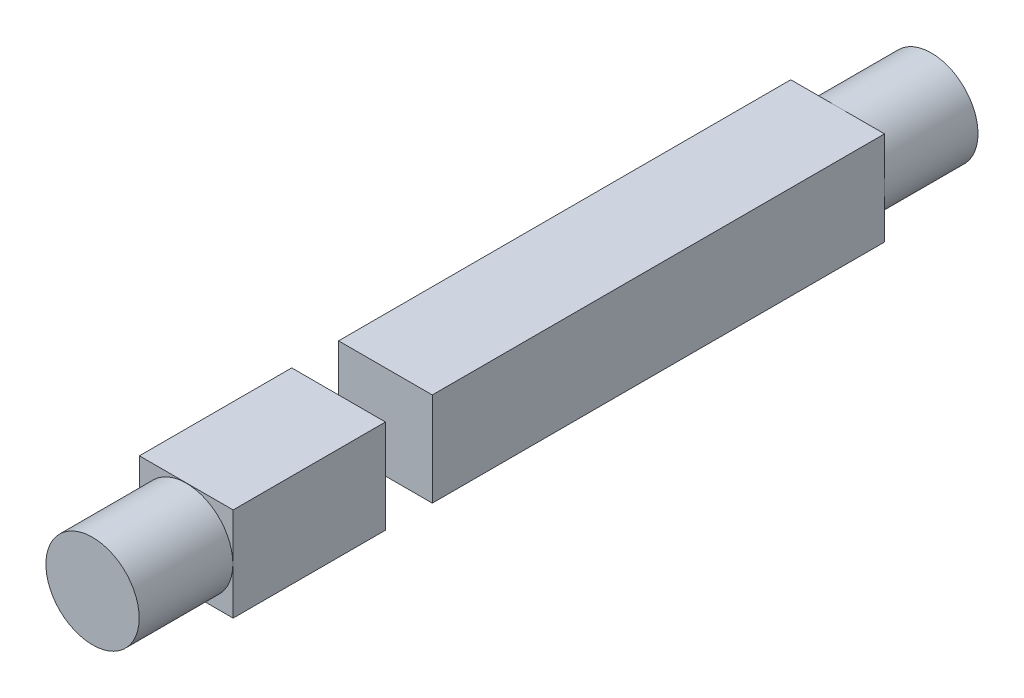
ISO-10303-21;
HEADER;
FILE_DESCRIPTION(('STEP AP214'),'2;1');
FILE_NAME('part.step','',(''),(''),'','','');
FILE_SCHEMA(('AUTOMOTIVE_DESIGN { 1 0 10303 214 1 1 1 1 }'));
ENDSEC;
DATA;
#1=APPLICATION_CONTEXT('core data for automotive mechanical design processes');
#2=APPLICATION_PROTOCOL_DEFINITION('international standard','automotive_design',2000,#1);
#3=PRODUCT_CONTEXT('',#1,'mechanical');
#4=PRODUCT('Part','Part','',(#3));
#5=PRODUCT_RELATED_PRODUCT_CATEGORY('part','',(#4));
#6=PRODUCT_DEFINITION_FORMATION('','',#4);
#7=PRODUCT_DEFINITION_CONTEXT('part definition',#1,'design');
#8=PRODUCT_DEFINITION('design','',#6,#7);
#9=PRODUCT_DEFINITION_SHAPE('','',#8);
#10=(LENGTH_UNIT() NAMED_UNIT(*) SI_UNIT(.MILLI.,.METRE.));
#11=(NAMED_UNIT(*) PLANE_ANGLE_UNIT() SI_UNIT($,.RADIAN.));
#12=(NAMED_UNIT(*) SI_UNIT($,.STERADIAN.) SOLID_ANGLE_UNIT());
#13=UNCERTAINTY_MEASURE_WITH_UNIT(LENGTH_MEASURE(1.E-05),#10,'distance_accuracy_value','');
#14=(GEOMETRIC_REPRESENTATION_CONTEXT(3) GLOBAL_UNCERTAINTY_ASSIGNED_CONTEXT((#13)) GLOBAL_UNIT_ASSIGNED_CONTEXT((#10,
#11,#12)) REPRESENTATION_CONTEXT('',''));
#15=CARTESIAN_POINT('',(0.,0.,0.));
#16=DIRECTION('',(0.,0.,1.));
#17=DIRECTION('',(1.,0.,0.));
#18=AXIS2_PLACEMENT_3D('',#15,#16,#17);
#19=CARTESIAN_POINT('',(-2.,-2.,13.9));
#20=DIRECTION('',(1.,0.,0.));
#21=DIRECTION('',(0.,0.,-1.));
#22=AXIS2_PLACEMENT_3D('',#19,#20,#21);
#23=PLANE('',#22);
#24=DIRECTION('',(0.,0.,-1.));
#25=VECTOR('',#24,1.);
#26=CARTESIAN_POINT('',(-2.,-2.,13.9));
#27=LINE('',#26,#25);
#28=CARTESIAN_POINT('',(-2.,-2.,5.4));
#29=VERTEX_POINT('',#28);
#30=CARTESIAN_POINT('',(-2.,-2.,-13.9));
#31=VERTEX_POINT('',#30);
#32=EDGE_CURVE('E98',#29,#31,#27,.T.);
#33=ORIENTED_EDGE('',*,*,#32,.F.);
#34=DIRECTION('',(0.,1.,0.));
#35=VECTOR('',#34,1.);
#36=CARTESIAN_POINT('',(-2.,-2.001,5.4));
#37=LINE('',#36,#35);
#38=CARTESIAN_POINT('',(-2.,2.,5.4));
#39=VERTEX_POINT('',#38);
#40=EDGE_CURVE('E66',#29,#39,#37,.T.);
#41=ORIENTED_EDGE('',*,*,#40,.T.);
#42=DIRECTION('',(0.,0.,-1.));
#43=VECTOR('',#42,1.);
#44=CARTESIAN_POINT('',(-2.,2.,13.9));
#45=LINE('',#44,#43);
#46=CARTESIAN_POINT('',(-2.,2.,-13.9));
#47=VERTEX_POINT('',#46);
#48=EDGE_CURVE('E53',#39,#47,#45,.T.);
#49=ORIENTED_EDGE('',*,*,#48,.T.);
#50=DIRECTION('',(0.,-1.,0.));
#51=VECTOR('',#50,1.);
#52=CARTESIAN_POINT('',(-2.,-2.,-13.9));
#53=LINE('',#52,#51);
#54=EDGE_CURVE('E104',#47,#31,#53,.T.);
#55=ORIENTED_EDGE('',*,*,#54,.T.);
#56=EDGE_LOOP('',(#33,#41,#49,#55));
#57=FACE_BOUND('',#56,.T.);
#58=ADVANCED_FACE('F50',(#57),#23,.F.);
#59=CARTESIAN_POINT('',(2.,-2.,13.9));
#60=DIRECTION('',(0.,1.,0.));
#61=DIRECTION('',(-1.,0.,0.));
#62=AXIS2_PLACEMENT_3D('',#59,#60,#61);
#63=PLANE('',#62);
#64=DIRECTION('',(0.,0.,-1.));
#65=VECTOR('',#64,1.);
#66=CARTESIAN_POINT('',(2.,-2.,13.9));
#67=LINE('',#66,#65);
#68=CARTESIAN_POINT('',(2.,-2.,5.4));
#69=VERTEX_POINT('',#68);
#70=CARTESIAN_POINT('',(2.,-2.,-13.9));
#71=VERTEX_POINT('',#70);
#72=EDGE_CURVE('E111',#69,#71,#67,.T.);
#73=ORIENTED_EDGE('',*,*,#72,.F.);
#74=DIRECTION('',(1.,0.,0.));
#75=VECTOR('',#74,1.);
#76=CARTESIAN_POINT('',(-2.,-2.,5.4));
#77=LINE('',#76,#75);
#78=EDGE_CURVE('E75',#29,#69,#77,.T.);
#79=ORIENTED_EDGE('',*,*,#78,.F.);
#80=ORIENTED_EDGE('',*,*,#32,.T.);
#81=DIRECTION('',(1.,0.,0.));
#82=VECTOR('',#81,1.);
#83=CARTESIAN_POINT('',(2.,-2.,-13.9));
#84=LINE('',#83,#82);
#85=EDGE_CURVE('E102',#31,#71,#84,.T.);
#86=ORIENTED_EDGE('',*,*,#85,.T.);
#87=EDGE_LOOP('',(#73,#79,#80,#86));
#88=FACE_BOUND('',#87,.T.);
#89=ADVANCED_FACE('F101',(#88),#63,.F.);
#90=CARTESIAN_POINT('',(2.,-2.,13.9));
#91=DIRECTION('',(-1.,0.,0.));
#92=DIRECTION('',(0.,0.,1.));
#93=AXIS2_PLACEMENT_3D('',#90,#91,#92);
#94=PLANE('',#93);
#95=DIRECTION('',(0.,0.,-1.));
#96=VECTOR('',#95,1.);
#97=CARTESIAN_POINT('',(2.,2.,13.9));
#98=LINE('',#97,#96);
#99=CARTESIAN_POINT('',(2.,2.,5.4));
#100=VERTEX_POINT('',#99);
#101=CARTESIAN_POINT('',(2.,2.,-13.9));
#102=VERTEX_POINT('',#101);
#103=EDGE_CURVE('E85',#100,#102,#98,.T.);
#104=ORIENTED_EDGE('',*,*,#103,.F.);
#105=DIRECTION('',(0.,1.,0.));
#106=VECTOR('',#105,1.);
#107=CARTESIAN_POINT('',(2.,-2.001,5.4));
#108=LINE('',#107,#106);
#109=EDGE_CURVE('E59',#69,#100,#108,.T.);
#110=ORIENTED_EDGE('',*,*,#109,.F.);
#111=ORIENTED_EDGE('',*,*,#72,.T.);
#112=DIRECTION('',(0.,1.,0.));
#113=VECTOR('',#112,1.);
#114=CARTESIAN_POINT('',(2.,-2.,-13.9));
#115=LINE('',#114,#113);
#116=EDGE_CURVE('E110',#71,#102,#115,.T.);
#117=ORIENTED_EDGE('',*,*,#116,.T.);
#118=EDGE_LOOP('',(#104,#110,#111,#117));
#119=FACE_BOUND('',#118,.T.);
#120=ADVANCED_FACE('F128',(#119),#94,.F.);
#121=CARTESIAN_POINT('',(2.,2.,13.9));
#122=DIRECTION('',(0.,-1.,0.));
#123=DIRECTION('',(1.,0.,0.));
#124=AXIS2_PLACEMENT_3D('',#121,#122,#123);
#125=PLANE('',#124);
#126=ORIENTED_EDGE('',*,*,#48,.F.);
#127=DIRECTION('',(-1.,0.,0.));
#128=VECTOR('',#127,1.);
#129=CARTESIAN_POINT('',(-2.,2.,5.4));
#130=LINE('',#129,#128);
#131=EDGE_CURVE('E12',#100,#39,#130,.T.);
#132=ORIENTED_EDGE('',*,*,#131,.F.);
#133=ORIENTED_EDGE('',*,*,#103,.T.);
#134=DIRECTION('',(-1.,0.,0.));
#135=VECTOR('',#134,1.);
#136=CARTESIAN_POINT('',(2.,2.,-13.9));
#137=LINE('',#136,#135);
#138=EDGE_CURVE('E120',#102,#47,#137,.T.);
#139=ORIENTED_EDGE('',*,*,#138,.T.);
#140=EDGE_LOOP('',(#126,#132,#133,#139));
#141=FACE_BOUND('',#140,.T.);
#142=ADVANCED_FACE('F129',(#141),#125,.F.);
#143=CARTESIAN_POINT('',(0.,0.,-13.9));
#144=DIRECTION('',(0.,0.,1.));
#145=DIRECTION('',(1.,0.,0.));
#146=AXIS2_PLACEMENT_3D('',#143,#144,#145);
#147=PLANE('',#146);
#148=CARTESIAN_POINT('',(0.,0.,-13.9));
#149=DIRECTION('',(0.,0.,1.));
#150=DIRECTION('',(1.,0.,0.));
#151=AXIS2_PLACEMENT_3D('',#148,#149,#150);
#152=CIRCLE('',#151,1.99);
#153=CARTESIAN_POINT('',(1.99,0.,-13.9));
#154=VERTEX_POINT('',#153);
#155=EDGE_CURVE('E116',#154,#154,#152,.T.);
#156=ORIENTED_EDGE('',*,*,#155,.T.);
#157=EDGE_LOOP('',(#156));
#158=FACE_BOUND('',#157,.T.);
#159=ORIENTED_EDGE('',*,*,#54,.F.);
#160=ORIENTED_EDGE('',*,*,#138,.F.);
#161=ORIENTED_EDGE('',*,*,#116,.F.);
#162=ORIENTED_EDGE('',*,*,#85,.F.);
#163=EDGE_LOOP('',(#159,#160,#161,#162));
#164=FACE_BOUND('',#163,.T.);
#165=ADVANCED_FACE('F108',(#158,#164),#147,.F.);
#166=CARTESIAN_POINT('',(0.,0.,-17.9));
#167=DIRECTION('',(0.,0.,1.));
#168=DIRECTION('',(1.,0.,0.));
#169=AXIS2_PLACEMENT_3D('',#166,#167,#168);
#170=CYLINDRICAL_SURFACE('',#169,1.99);
#171=CARTESIAN_POINT('',(0.,0.,-17.9));
#172=DIRECTION('',(0.,0.,1.));
#173=DIRECTION('',(1.,0.,0.));
#174=AXIS2_PLACEMENT_3D('',#171,#172,#173);
#175=CIRCLE('',#174,1.99);
#176=CARTESIAN_POINT('',(1.99,0.,-17.9));
#177=VERTEX_POINT('',#176);
#178=EDGE_CURVE('E119',#177,#177,#175,.T.);
#179=ORIENTED_EDGE('',*,*,#178,.T.);
#180=EDGE_LOOP('',(#179));
#181=FACE_BOUND('',#180,.T.);
#182=ORIENTED_EDGE('',*,*,#155,.F.);
#183=EDGE_LOOP('',(#182));
#184=FACE_BOUND('',#183,.T.);
#185=ADVANCED_FACE('F137',(#181,#184),#170,.T.);
#186=CARTESIAN_POINT('',(0.,0.,-17.9));
#187=DIRECTION('',(0.,0.,-1.));
#188=DIRECTION('',(1.,0.,0.));
#189=AXIS2_PLACEMENT_3D('',#186,#187,#188);
#190=PLANE('',#189);
#191=ORIENTED_EDGE('',*,*,#178,.F.);
#192=EDGE_LOOP('',(#191));
#193=FACE_BOUND('',#192,.T.);
#194=ADVANCED_FACE('F132',(#193),#190,.T.);
#195=CARTESIAN_POINT('',(-2.,-2.001,5.4));
#196=DIRECTION('',(0.,0.,-1.));
#197=DIRECTION('',(-1.,0.,0.));
#198=AXIS2_PLACEMENT_3D('',#195,#196,#197);
#199=PLANE('',#198);
#200=ORIENTED_EDGE('',*,*,#78,.T.);
#201=ORIENTED_EDGE('',*,*,#109,.T.);
#202=ORIENTED_EDGE('',*,*,#131,.T.);
#203=ORIENTED_EDGE('',*,*,#40,.F.);
#204=EDGE_LOOP('',(#200,#201,#202,#203));
#205=FACE_BOUND('',#204,.T.);
#206=ADVANCED_FACE('F130',(#205),#199,.F.);
#207=CLOSED_SHELL('',(#58,#89,#120,#142,#165,#185,#194,#206));
#208=MANIFOLD_SOLID_BREP('B2',#207);
#209=CARTESIAN_POINT('',(0.,0.,17.9));
#210=DIRECTION('',(0.,0.,1.));
#211=DIRECTION('',(1.,0.,0.));
#212=AXIS2_PLACEMENT_3D('',#209,#210,#211);
#213=PLANE('',#212);
#214=CARTESIAN_POINT('',(0.,0.,17.9));
#215=DIRECTION('',(0.,0.,1.));
#216=DIRECTION('',(1.,0.,0.));
#217=AXIS2_PLACEMENT_3D('',#214,#215,#216);
#218=CIRCLE('',#217,1.99);
#219=CARTESIAN_POINT('',(1.99,0.,17.9));
#220=VERTEX_POINT('',#219);
#221=EDGE_CURVE('E252',#220,#220,#218,.T.);
#222=ORIENTED_EDGE('',*,*,#221,.T.);
#223=EDGE_LOOP('',(#222));
#224=FACE_BOUND('',#223,.T.);
#225=ADVANCED_FACE('F203',(#224),#213,.T.);
#226=CARTESIAN_POINT('',(0.,0.,17.9));
#227=DIRECTION('',(0.,0.,-1.));
#228=DIRECTION('',(-1.,0.,0.));
#229=AXIS2_PLACEMENT_3D('',#226,#227,#228);
#230=CYLINDRICAL_SURFACE('',#229,1.99);
#231=ORIENTED_EDGE('',*,*,#221,.F.);
#232=EDGE_LOOP('',(#231));
#233=FACE_BOUND('',#232,.T.);
#234=CARTESIAN_POINT('',(0.,0.,13.9));
#235=DIRECTION('',(0.,0.,1.));
#236=DIRECTION('',(1.,0.,0.));
#237=AXIS2_PLACEMENT_3D('',#234,#235,#236);
#238=CIRCLE('',#237,1.99);
#239=CARTESIAN_POINT('',(1.99,0.,13.9));
#240=VERTEX_POINT('',#239);
#241=EDGE_CURVE('E48',#240,#240,#238,.T.);
#242=ORIENTED_EDGE('',*,*,#241,.T.);
#243=EDGE_LOOP('',(#242));
#244=FACE_BOUND('',#243,.T.);
#245=ADVANCED_FACE('F286',(#233,#244),#230,.T.);
#246=CARTESIAN_POINT('',(0.,0.,13.9));
#247=DIRECTION('',(0.,0.,1.));
#248=DIRECTION('',(1.,0.,0.));
#249=AXIS2_PLACEMENT_3D('',#246,#247,#248);
#250=PLANE('',#249);
#251=ORIENTED_EDGE('',*,*,#241,.F.);
#252=EDGE_LOOP('',(#251));
#253=FACE_BOUND('',#252,.T.);
#254=DIRECTION('',(0.,-1.,0.));
#255=VECTOR('',#254,1.);
#256=CARTESIAN_POINT('',(-2.,-2.,13.9));
#257=LINE('',#256,#255);
#258=CARTESIAN_POINT('',(-2.,2.,13.9));
#259=VERTEX_POINT('',#258);
#260=CARTESIAN_POINT('',(-2.,-2.,13.9));
#261=VERTEX_POINT('',#260);
#262=EDGE_CURVE('E275',#259,#261,#257,.T.);
#263=ORIENTED_EDGE('',*,*,#262,.T.);
#264=DIRECTION('',(1.,0.,0.));
#265=VECTOR('',#264,1.);
#266=CARTESIAN_POINT('',(2.,-2.,13.9));
#267=LINE('',#266,#265);
#268=CARTESIAN_POINT('',(2.,-2.,13.9));
#269=VERTEX_POINT('',#268);
#270=EDGE_CURVE('E262',#261,#269,#267,.T.);
#271=ORIENTED_EDGE('',*,*,#270,.T.);
#272=DIRECTION('',(0.,1.,0.));
#273=VECTOR('',#272,1.);
#274=CARTESIAN_POINT('',(2.,-2.,13.9));
#275=LINE('',#274,#273);
#276=CARTESIAN_POINT('',(2.,2.,13.9));
#277=VERTEX_POINT('',#276);
#278=EDGE_CURVE('E272',#269,#277,#275,.T.);
#279=ORIENTED_EDGE('',*,*,#278,.T.);
#280=DIRECTION('',(-1.,0.,0.));
#281=VECTOR('',#280,1.);
#282=CARTESIAN_POINT('',(2.,2.,13.9));
#283=LINE('',#282,#281);
#284=EDGE_CURVE('E227',#277,#259,#283,.T.);
#285=ORIENTED_EDGE('',*,*,#284,.T.);
#286=EDGE_LOOP('',(#263,#271,#279,#285));
#287=FACE_BOUND('',#286,.T.);
#288=ADVANCED_FACE('F284',(#253,#287),#250,.T.);
#289=CARTESIAN_POINT('',(2.,2.,13.9));
#290=DIRECTION('',(0.,-1.,0.));
#291=DIRECTION('',(1.,0.,0.));
#292=AXIS2_PLACEMENT_3D('',#289,#290,#291);
#293=PLANE('',#292);
#294=DIRECTION('',(0.,0.,-1.));
#295=VECTOR('',#294,1.);
#296=CARTESIAN_POINT('',(2.,2.,13.9));
#297=LINE('',#296,#295);
#298=CARTESIAN_POINT('',(2.,2.,7.4));
#299=VERTEX_POINT('',#298);
#300=EDGE_CURVE('E264',#277,#299,#297,.T.);
#301=ORIENTED_EDGE('',*,*,#300,.T.);
#302=DIRECTION('',(1.,0.,0.));
#303=VECTOR('',#302,1.);
#304=CARTESIAN_POINT('',(-2.,2.,7.4));
#305=LINE('',#304,#303);
#306=CARTESIAN_POINT('',(-2.,2.,7.4));
#307=VERTEX_POINT('',#306);
#308=EDGE_CURVE('E259',#307,#299,#305,.T.);
#309=ORIENTED_EDGE('',*,*,#308,.F.);
#310=DIRECTION('',(0.,0.,-1.));
#311=VECTOR('',#310,1.);
#312=CARTESIAN_POINT('',(-2.,2.,13.9));
#313=LINE('',#312,#311);
#314=EDGE_CURVE('E258',#259,#307,#313,.T.);
#315=ORIENTED_EDGE('',*,*,#314,.F.);
#316=ORIENTED_EDGE('',*,*,#284,.F.);
#317=EDGE_LOOP('',(#301,#309,#315,#316));
#318=FACE_BOUND('',#317,.T.);
#319=ADVANCED_FACE('F283',(#318),#293,.F.);
#320=CARTESIAN_POINT('',(2.,-2.,13.9));
#321=DIRECTION('',(-1.,0.,0.));
#322=DIRECTION('',(0.,0.,1.));
#323=AXIS2_PLACEMENT_3D('',#320,#321,#322);
#324=PLANE('',#323);
#325=DIRECTION('',(0.,0.,-1.));
#326=VECTOR('',#325,1.);
#327=CARTESIAN_POINT('',(2.,-2.,13.9));
#328=LINE('',#327,#326);
#329=CARTESIAN_POINT('',(2.,-2.,7.4));
#330=VERTEX_POINT('',#329);
#331=EDGE_CURVE('E263',#269,#330,#328,.T.);
#332=ORIENTED_EDGE('',*,*,#331,.T.);
#333=DIRECTION('',(0.,1.,0.));
#334=VECTOR('',#333,1.);
#335=CARTESIAN_POINT('',(2.,-2.001,7.4));
#336=LINE('',#335,#334);
#337=EDGE_CURVE('E247',#330,#299,#336,.T.);
#338=ORIENTED_EDGE('',*,*,#337,.T.);
#339=ORIENTED_EDGE('',*,*,#300,.F.);
#340=ORIENTED_EDGE('',*,*,#278,.F.);
#341=EDGE_LOOP('',(#332,#338,#339,#340));
#342=FACE_BOUND('',#341,.T.);
#343=ADVANCED_FACE('F282',(#342),#324,.F.);
#344=CARTESIAN_POINT('',(2.,-2.,13.9));
#345=DIRECTION('',(0.,1.,0.));
#346=DIRECTION('',(-1.,0.,0.));
#347=AXIS2_PLACEMENT_3D('',#344,#345,#346);
#348=PLANE('',#347);
#349=DIRECTION('',(0.,0.,-1.));
#350=VECTOR('',#349,1.);
#351=CARTESIAN_POINT('',(-2.,-2.,13.9));
#352=LINE('',#351,#350);
#353=CARTESIAN_POINT('',(-2.,-2.,7.4));
#354=VERTEX_POINT('',#353);
#355=EDGE_CURVE('E207',#261,#354,#352,.T.);
#356=ORIENTED_EDGE('',*,*,#355,.T.);
#357=DIRECTION('',(-1.,0.,0.));
#358=VECTOR('',#357,1.);
#359=CARTESIAN_POINT('',(-2.,-2.,7.4));
#360=LINE('',#359,#358);
#361=EDGE_CURVE('E244',#330,#354,#360,.T.);
#362=ORIENTED_EDGE('',*,*,#361,.F.);
#363=ORIENTED_EDGE('',*,*,#331,.F.);
#364=ORIENTED_EDGE('',*,*,#270,.F.);
#365=EDGE_LOOP('',(#356,#362,#363,#364));
#366=FACE_BOUND('',#365,.T.);
#367=ADVANCED_FACE('F261',(#366),#348,.F.);
#368=CARTESIAN_POINT('',(-2.,-2.,13.9));
#369=DIRECTION('',(1.,0.,0.));
#370=DIRECTION('',(0.,0.,-1.));
#371=AXIS2_PLACEMENT_3D('',#368,#369,#370);
#372=PLANE('',#371);
#373=ORIENTED_EDGE('',*,*,#314,.T.);
#374=DIRECTION('',(0.,1.,0.));
#375=VECTOR('',#374,1.);
#376=CARTESIAN_POINT('',(-2.,-2.001,7.4));
#377=LINE('',#376,#375);
#378=EDGE_CURVE('E219',#354,#307,#377,.T.);
#379=ORIENTED_EDGE('',*,*,#378,.F.);
#380=ORIENTED_EDGE('',*,*,#355,.F.);
#381=ORIENTED_EDGE('',*,*,#262,.F.);
#382=EDGE_LOOP('',(#373,#379,#380,#381));
#383=FACE_BOUND('',#382,.T.);
#384=ADVANCED_FACE('F205',(#383),#372,.F.);
#385=CARTESIAN_POINT('',(-2.,-2.001,7.4));
#386=DIRECTION('',(0.,0.,1.));
#387=DIRECTION('',(1.,0.,0.));
#388=AXIS2_PLACEMENT_3D('',#385,#386,#387);
#389=PLANE('',#388);
#390=ORIENTED_EDGE('',*,*,#361,.T.);
#391=ORIENTED_EDGE('',*,*,#378,.T.);
#392=ORIENTED_EDGE('',*,*,#308,.T.);
#393=ORIENTED_EDGE('',*,*,#337,.F.);
#394=EDGE_LOOP('',(#390,#391,#392,#393));
#395=FACE_BOUND('',#394,.T.);
#396=ADVANCED_FACE('F245',(#395),#389,.F.);
#397=CLOSED_SHELL('',(#225,#245,#288,#319,#343,#367,#384,#396));
#398=MANIFOLD_SOLID_BREP('B6',#397);
#399=ADVANCED_BREP_SHAPE_REPRESENTATION('',(#18,#208,#398),#14);
#400=SHAPE_DEFINITION_REPRESENTATION(#9,#399);
ENDSEC;
END-ISO-10303-21;
